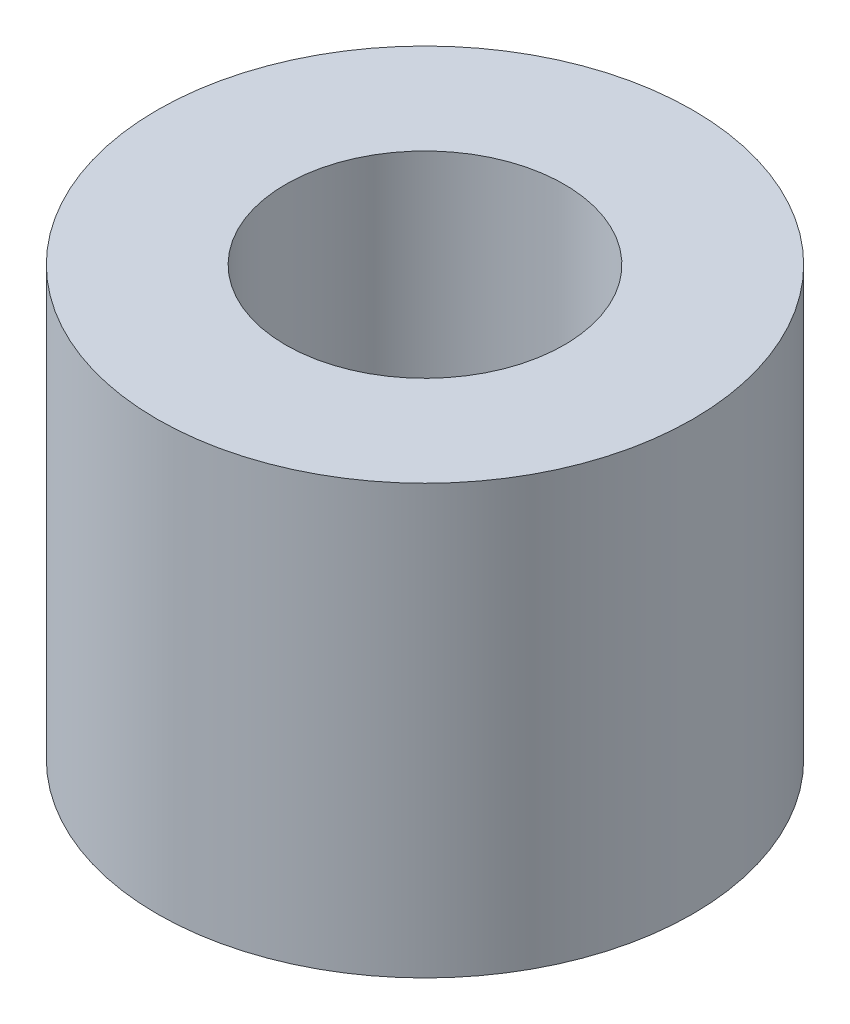
ISO-10303-21;
HEADER;
FILE_DESCRIPTION(('STEP AP214'),'2;1');
FILE_NAME('part.step','',(''),(''),'','','');
FILE_SCHEMA(('AUTOMOTIVE_DESIGN { 1 0 10303 214 1 1 1 1 }'));
ENDSEC;
DATA;
#1=APPLICATION_CONTEXT('core data for automotive mechanical design processes');
#2=APPLICATION_PROTOCOL_DEFINITION('international standard','automotive_design',2000,#1);
#3=PRODUCT_CONTEXT('',#1,'mechanical');
#4=PRODUCT('Part','Part','',(#3));
#5=PRODUCT_RELATED_PRODUCT_CATEGORY('part','',(#4));
#6=PRODUCT_DEFINITION_FORMATION('','',#4);
#7=PRODUCT_DEFINITION_CONTEXT('part definition',#1,'design');
#8=PRODUCT_DEFINITION('design','',#6,#7);
#9=PRODUCT_DEFINITION_SHAPE('','',#8);
#10=(LENGTH_UNIT() NAMED_UNIT(*) SI_UNIT(.MILLI.,.METRE.));
#11=(NAMED_UNIT(*) PLANE_ANGLE_UNIT() SI_UNIT($,.RADIAN.));
#12=(NAMED_UNIT(*) SI_UNIT($,.STERADIAN.) SOLID_ANGLE_UNIT());
#13=UNCERTAINTY_MEASURE_WITH_UNIT(LENGTH_MEASURE(1.E-05),#10,'distance_accuracy_value','');
#14=(GEOMETRIC_REPRESENTATION_CONTEXT(3) GLOBAL_UNCERTAINTY_ASSIGNED_CONTEXT((#13)) GLOBAL_UNIT_ASSIGNED_CONTEXT((#10,
#11,#12)) REPRESENTATION_CONTEXT('',''));
#15=CARTESIAN_POINT('',(0.,0.,0.));
#16=DIRECTION('',(0.,0.,1.));
#17=DIRECTION('',(1.,0.,0.));
#18=AXIS2_PLACEMENT_3D('',#15,#16,#17);
#19=CARTESIAN_POINT('',(0.,8.,0.));
#20=DIRECTION('',(0.,1.,0.));
#21=DIRECTION('',(0.,0.,1.));
#22=AXIS2_PLACEMENT_3D('',#19,#20,#21);
#23=PLANE('',#22);
#24=CARTESIAN_POINT('',(0.,8.,0.));
#25=DIRECTION('',(0.,1.,0.));
#26=DIRECTION('',(0.,0.,1.));
#27=AXIS2_PLACEMENT_3D('',#24,#25,#26);
#28=CIRCLE('',#27,5.);
#29=CARTESIAN_POINT('',(0.,8.,5.));
#30=VERTEX_POINT('',#29);
#31=EDGE_CURVE('E10',#30,#30,#28,.T.);
#32=ORIENTED_EDGE('',*,*,#31,.T.);
#33=EDGE_LOOP('',(#32));
#34=FACE_BOUND('',#33,.T.);
#35=CARTESIAN_POINT('',(0.,8.,0.));
#36=DIRECTION('',(0.,1.,0.));
#37=DIRECTION('',(0.,0.,1.));
#38=AXIS2_PLACEMENT_3D('',#35,#36,#37);
#39=CIRCLE('',#38,2.6);
#40=CARTESIAN_POINT('',(0.,8.,2.6));
#41=VERTEX_POINT('',#40);
#42=EDGE_CURVE('E42',#41,#41,#39,.T.);
#43=ORIENTED_EDGE('',*,*,#42,.F.);
#44=EDGE_LOOP('',(#43));
#45=FACE_BOUND('',#44,.T.);
#46=ADVANCED_FACE('F31',(#34,#45),#23,.T.);
#47=CARTESIAN_POINT('',(0.,0.,0.));
#48=DIRECTION('',(0.,1.,0.));
#49=DIRECTION('',(0.,0.,1.));
#50=AXIS2_PLACEMENT_3D('',#47,#48,#49);
#51=PLANE('',#50);
#52=CARTESIAN_POINT('',(0.,0.,0.));
#53=DIRECTION('',(0.,1.,0.));
#54=DIRECTION('',(0.,0.,1.));
#55=AXIS2_PLACEMENT_3D('',#52,#53,#54);
#56=CIRCLE('',#55,5.);
#57=CARTESIAN_POINT('',(0.,0.,5.));
#58=VERTEX_POINT('',#57);
#59=EDGE_CURVE('E35',#58,#58,#56,.T.);
#60=ORIENTED_EDGE('',*,*,#59,.F.);
#61=EDGE_LOOP('',(#60));
#62=FACE_BOUND('',#61,.T.);
#63=CARTESIAN_POINT('',(0.,0.,0.));
#64=DIRECTION('',(0.,1.,0.));
#65=DIRECTION('',(0.,0.,1.));
#66=AXIS2_PLACEMENT_3D('',#63,#64,#65);
#67=CIRCLE('',#66,2.6);
#68=CARTESIAN_POINT('',(0.,0.,2.6));
#69=VERTEX_POINT('',#68);
#70=EDGE_CURVE('E44',#69,#69,#67,.T.);
#71=ORIENTED_EDGE('',*,*,#70,.T.);
#72=EDGE_LOOP('',(#71));
#73=FACE_BOUND('',#72,.T.);
#74=ADVANCED_FACE('F54',(#62,#73),#51,.F.);
#75=CARTESIAN_POINT('',(0.,8.,0.));
#76=DIRECTION('',(0.,-1.,0.));
#77=DIRECTION('',(0.,0.,-1.));
#78=AXIS2_PLACEMENT_3D('',#75,#76,#77);
#79=CYLINDRICAL_SURFACE('',#78,5.);
#80=ORIENTED_EDGE('',*,*,#31,.F.);
#81=EDGE_LOOP('',(#80));
#82=FACE_BOUND('',#81,.T.);
#83=ORIENTED_EDGE('',*,*,#59,.T.);
#84=EDGE_LOOP('',(#83));
#85=FACE_BOUND('',#84,.T.);
#86=ADVANCED_FACE('F33',(#82,#85),#79,.T.);
#87=CARTESIAN_POINT('',(0.,8.,0.));
#88=DIRECTION('',(0.,-1.,0.));
#89=DIRECTION('',(0.,0.,-1.));
#90=AXIS2_PLACEMENT_3D('',#87,#88,#89);
#91=CYLINDRICAL_SURFACE('',#90,2.6);
#92=ORIENTED_EDGE('',*,*,#42,.T.);
#93=EDGE_LOOP('',(#92));
#94=FACE_BOUND('',#93,.T.);
#95=ORIENTED_EDGE('',*,*,#70,.F.);
#96=EDGE_LOOP('',(#95));
#97=FACE_BOUND('',#96,.T.);
#98=ADVANCED_FACE('F50',(#94,#97),#91,.F.);
#99=CLOSED_SHELL('',(#46,#74,#86,#98));
#100=MANIFOLD_SOLID_BREP('B2',#99);
#101=ADVANCED_BREP_SHAPE_REPRESENTATION('',(#18,#100),#14);
#102=SHAPE_DEFINITION_REPRESENTATION(#9,#101);
ENDSEC;
END-ISO-10303-21;
